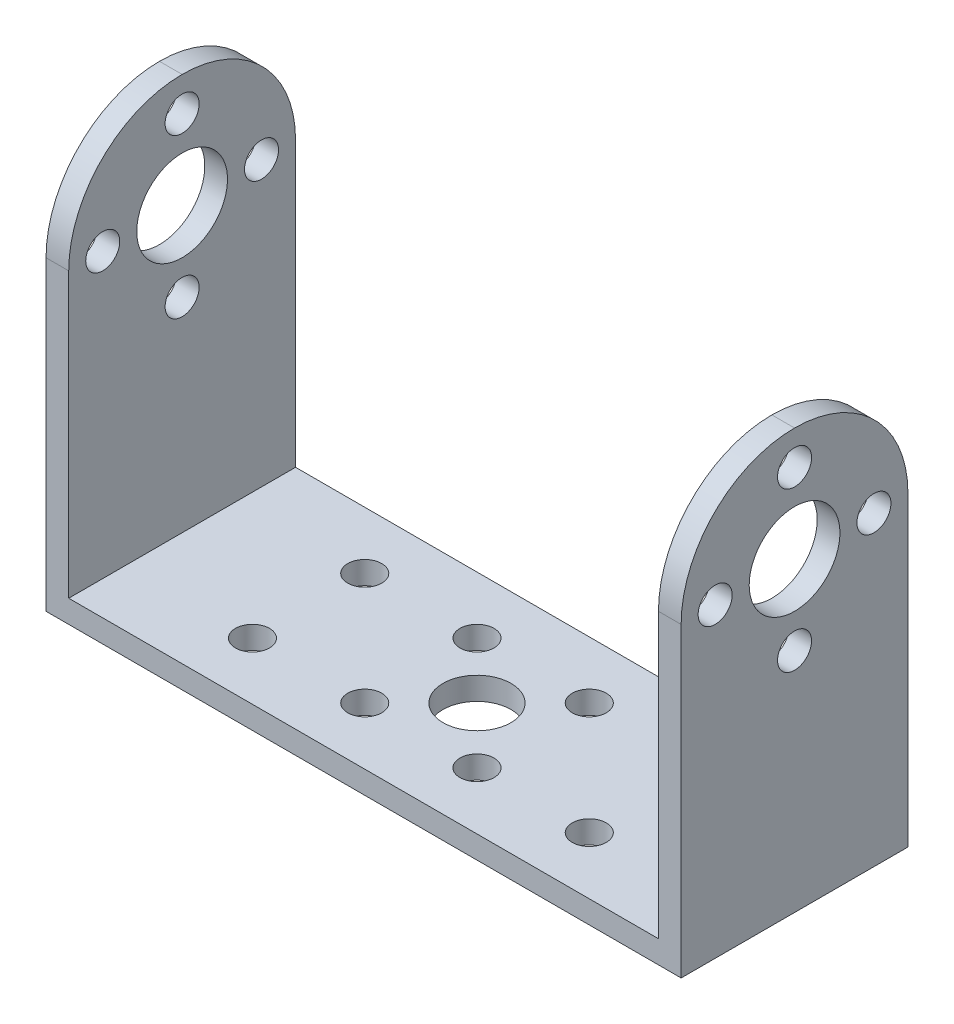
ISO-10303-21;
HEADER;
FILE_DESCRIPTION(('STEP AP214'),'2;1');
FILE_NAME('part.step','',(''),(''),'','','');
FILE_SCHEMA(('AUTOMOTIVE_DESIGN { 1 0 10303 214 1 1 1 1 }'));
ENDSEC;
DATA;
#1=APPLICATION_CONTEXT('core data for automotive mechanical design processes');
#2=APPLICATION_PROTOCOL_DEFINITION('international standard','automotive_design',2000,#1);
#3=PRODUCT_CONTEXT('',#1,'mechanical');
#4=PRODUCT('Part','Part','',(#3));
#5=PRODUCT_RELATED_PRODUCT_CATEGORY('part','',(#4));
#6=PRODUCT_DEFINITION_FORMATION('','',#4);
#7=PRODUCT_DEFINITION_CONTEXT('part definition',#1,'design');
#8=PRODUCT_DEFINITION('design','',#6,#7);
#9=PRODUCT_DEFINITION_SHAPE('','',#8);
#10=(LENGTH_UNIT() NAMED_UNIT(*) SI_UNIT(.MILLI.,.METRE.));
#11=(NAMED_UNIT(*) PLANE_ANGLE_UNIT() SI_UNIT($,.RADIAN.));
#12=(NAMED_UNIT(*) SI_UNIT($,.STERADIAN.) SOLID_ANGLE_UNIT());
#13=UNCERTAINTY_MEASURE_WITH_UNIT(LENGTH_MEASURE(1.E-05),#10,'distance_accuracy_value','');
#14=(GEOMETRIC_REPRESENTATION_CONTEXT(3) GLOBAL_UNCERTAINTY_ASSIGNED_CONTEXT((#13)) GLOBAL_UNIT_ASSIGNED_CONTEXT((#10,
#11,#12)) REPRESENTATION_CONTEXT('',''));
#15=CARTESIAN_POINT('',(0.,0.,0.));
#16=DIRECTION('',(0.,0.,1.));
#17=DIRECTION('',(1.,0.,0.));
#18=AXIS2_PLACEMENT_3D('',#15,#16,#17);
#19=CARTESIAN_POINT('',(2.,0.,20.));
#20=DIRECTION('',(-1.,0.,0.));
#21=DIRECTION('',(0.,0.,1.));
#22=AXIS2_PLACEMENT_3D('',#19,#20,#21);
#23=PLANE('',#22);
#24=CARTESIAN_POINT('',(2.,34.,10.));
#25=DIRECTION('',(-1.,0.,0.));
#26=DIRECTION('',(0.,0.,1.));
#27=AXIS2_PLACEMENT_3D('',#24,#25,#26);
#28=CIRCLE('',#27,1.5);
#29=CARTESIAN_POINT('',(2.,34.,11.5));
#30=VERTEX_POINT('',#29);
#31=EDGE_CURVE('E194',#30,#30,#28,.T.);
#32=ORIENTED_EDGE('',*,*,#31,.T.);
#33=EDGE_LOOP('',(#32));
#34=FACE_BOUND('',#33,.T.);
#35=CARTESIAN_POINT('',(2.,27.0000000000001,17.0000000000001));
#36=DIRECTION('',(-1.,0.,0.));
#37=DIRECTION('',(0.,0.,1.));
#38=AXIS2_PLACEMENT_3D('',#35,#36,#37);
#39=CIRCLE('',#38,1.5);
#40=CARTESIAN_POINT('',(2.,27.0000000000001,18.5000000000001));
#41=VERTEX_POINT('',#40);
#42=EDGE_CURVE('E211',#41,#41,#39,.T.);
#43=ORIENTED_EDGE('',*,*,#42,.T.);
#44=EDGE_LOOP('',(#43));
#45=FACE_BOUND('',#44,.T.);
#46=CARTESIAN_POINT('',(2.,20.,10.0000000000001));
#47=DIRECTION('',(-1.,0.,0.));
#48=DIRECTION('',(0.,0.,1.));
#49=AXIS2_PLACEMENT_3D('',#46,#47,#48);
#50=CIRCLE('',#49,1.5);
#51=CARTESIAN_POINT('',(2.,20.,11.5000000000001));
#52=VERTEX_POINT('',#51);
#53=EDGE_CURVE('E207',#52,#52,#50,.T.);
#54=ORIENTED_EDGE('',*,*,#53,.T.);
#55=EDGE_LOOP('',(#54));
#56=FACE_BOUND('',#55,.T.);
#57=CARTESIAN_POINT('',(2.,27.,3.0000000000001));
#58=DIRECTION('',(-1.,0.,0.));
#59=DIRECTION('',(0.,0.,1.));
#60=AXIS2_PLACEMENT_3D('',#57,#58,#59);
#61=CIRCLE('',#60,1.5);
#62=CARTESIAN_POINT('',(2.,27.,4.5000000000001));
#63=VERTEX_POINT('',#62);
#64=EDGE_CURVE('E203',#63,#63,#61,.T.);
#65=ORIENTED_EDGE('',*,*,#64,.T.);
#66=EDGE_LOOP('',(#65));
#67=FACE_BOUND('',#66,.T.);
#68=CARTESIAN_POINT('',(2.,27.,10.0000000000001));
#69=DIRECTION('',(-1.,0.,0.));
#70=DIRECTION('',(0.,0.,1.));
#71=AXIS2_PLACEMENT_3D('',#68,#69,#70);
#72=CIRCLE('',#71,4.);
#73=CARTESIAN_POINT('',(2.,27.,14.0000000000001));
#74=VERTEX_POINT('',#73);
#75=EDGE_CURVE('E198',#74,#74,#72,.T.);
#76=ORIENTED_EDGE('',*,*,#75,.T.);
#77=EDGE_LOOP('',(#76));
#78=FACE_BOUND('',#77,.T.);
#79=DIRECTION('',(0.,1.,0.));
#80=VECTOR('',#79,1.);
#81=CARTESIAN_POINT('',(2.,0.,0.));
#82=LINE('',#81,#80);
#83=CARTESIAN_POINT('',(2.,2.,0.));
#84=VERTEX_POINT('',#83);
#85=CARTESIAN_POINT('',(2.,27.,0.));
#86=VERTEX_POINT('',#85);
#87=EDGE_CURVE('E151',#84,#86,#82,.T.);
#88=ORIENTED_EDGE('',*,*,#87,.T.);
#89=CARTESIAN_POINT('',(2.,27.,10.));
#90=DIRECTION('',(-1.,0.,0.));
#91=DIRECTION('',(0.,0.,1.));
#92=AXIS2_PLACEMENT_3D('',#89,#90,#91);
#93=CIRCLE('',#92,10.);
#94=CARTESIAN_POINT('',(2.,37.,10.));
#95=VERTEX_POINT('',#94);
#96=EDGE_CURVE('E62',#86,#95,#93,.F.);
#97=ORIENTED_EDGE('',*,*,#96,.T.);
#98=CARTESIAN_POINT('',(2.,27.,10.));
#99=DIRECTION('',(-1.,0.,0.));
#100=DIRECTION('',(0.,0.,1.));
#101=AXIS2_PLACEMENT_3D('',#98,#99,#100);
#102=CIRCLE('',#101,10.);
#103=CARTESIAN_POINT('',(2.,27.,20.));
#104=VERTEX_POINT('',#103);
#105=EDGE_CURVE('E185',#95,#104,#102,.F.);
#106=ORIENTED_EDGE('',*,*,#105,.T.);
#107=DIRECTION('',(0.,1.,0.));
#108=VECTOR('',#107,1.);
#109=CARTESIAN_POINT('',(2.,0.,20.));
#110=LINE('',#109,#108);
#111=CARTESIAN_POINT('',(2.,2.,20.));
#112=VERTEX_POINT('',#111);
#113=EDGE_CURVE('E136',#112,#104,#110,.T.);
#114=ORIENTED_EDGE('',*,*,#113,.F.);
#115=DIRECTION('',(0.,0.,-1.));
#116=VECTOR('',#115,1.);
#117=CARTESIAN_POINT('',(2.,2.,20.));
#118=LINE('',#117,#116);
#119=EDGE_CURVE('E150',#112,#84,#118,.T.);
#120=ORIENTED_EDGE('',*,*,#119,.T.);
#121=EDGE_LOOP('',(#88,#97,#106,#114,#120));
#122=FACE_BOUND('',#121,.T.);
#123=ADVANCED_FACE('F39',(#34,#45,#56,#67,#78,#122),#23,.F.);
#124=CARTESIAN_POINT('',(0.,0.,20.));
#125=DIRECTION('',(-1.,0.,0.));
#126=DIRECTION('',(0.,0.,1.));
#127=AXIS2_PLACEMENT_3D('',#124,#125,#126);
#128=PLANE('',#127);
#129=CARTESIAN_POINT('',(0.,34.,10.));
#130=DIRECTION('',(-1.,0.,0.));
#131=DIRECTION('',(0.,0.,1.));
#132=AXIS2_PLACEMENT_3D('',#129,#130,#131);
#133=CIRCLE('',#132,1.5);
#134=CARTESIAN_POINT('',(0.,34.,11.5));
#135=VERTEX_POINT('',#134);
#136=EDGE_CURVE('E254',#135,#135,#133,.T.);
#137=ORIENTED_EDGE('',*,*,#136,.F.);
#138=EDGE_LOOP('',(#137));
#139=FACE_BOUND('',#138,.T.);
#140=CARTESIAN_POINT('',(0.,27.0000000000001,17.0000000000001));
#141=DIRECTION('',(-1.,0.,0.));
#142=DIRECTION('',(0.,0.,1.));
#143=AXIS2_PLACEMENT_3D('',#140,#141,#142);
#144=CIRCLE('',#143,1.5);
#145=CARTESIAN_POINT('',(0.,27.0000000000001,18.5000000000001));
#146=VERTEX_POINT('',#145);
#147=EDGE_CURVE('E261',#146,#146,#144,.T.);
#148=ORIENTED_EDGE('',*,*,#147,.F.);
#149=EDGE_LOOP('',(#148));
#150=FACE_BOUND('',#149,.T.);
#151=CARTESIAN_POINT('',(0.,20.,10.0000000000001));
#152=DIRECTION('',(-1.,0.,0.));
#153=DIRECTION('',(0.,0.,1.));
#154=AXIS2_PLACEMENT_3D('',#151,#152,#153);
#155=CIRCLE('',#154,1.5);
#156=CARTESIAN_POINT('',(0.,20.,11.5000000000001));
#157=VERTEX_POINT('',#156);
#158=EDGE_CURVE('E267',#157,#157,#155,.T.);
#159=ORIENTED_EDGE('',*,*,#158,.F.);
#160=EDGE_LOOP('',(#159));
#161=FACE_BOUND('',#160,.T.);
#162=CARTESIAN_POINT('',(0.,27.,3.0000000000001));
#163=DIRECTION('',(-1.,0.,0.));
#164=DIRECTION('',(0.,0.,1.));
#165=AXIS2_PLACEMENT_3D('',#162,#163,#164);
#166=CIRCLE('',#165,1.5);
#167=CARTESIAN_POINT('',(0.,27.,4.5000000000001));
#168=VERTEX_POINT('',#167);
#169=EDGE_CURVE('E245',#168,#168,#166,.T.);
#170=ORIENTED_EDGE('',*,*,#169,.F.);
#171=EDGE_LOOP('',(#170));
#172=FACE_BOUND('',#171,.T.);
#173=CARTESIAN_POINT('',(0.,27.,10.0000000000001));
#174=DIRECTION('',(-1.,0.,0.));
#175=DIRECTION('',(0.,0.,1.));
#176=AXIS2_PLACEMENT_3D('',#173,#174,#175);
#177=CIRCLE('',#176,4.);
#178=CARTESIAN_POINT('',(0.,27.,14.0000000000001));
#179=VERTEX_POINT('',#178);
#180=EDGE_CURVE('E257',#179,#179,#177,.T.);
#181=ORIENTED_EDGE('',*,*,#180,.F.);
#182=EDGE_LOOP('',(#181));
#183=FACE_BOUND('',#182,.T.);
#184=CARTESIAN_POINT('',(0.,27.,10.));
#185=DIRECTION('',(-1.,0.,0.));
#186=DIRECTION('',(0.,0.,1.));
#187=AXIS2_PLACEMENT_3D('',#184,#185,#186);
#188=CIRCLE('',#187,10.);
#189=CARTESIAN_POINT('',(0.,27.,20.));
#190=VERTEX_POINT('',#189);
#191=CARTESIAN_POINT('',(0.,37.,10.));
#192=VERTEX_POINT('',#191);
#193=EDGE_CURVE('E48',#190,#192,#188,.T.);
#194=ORIENTED_EDGE('',*,*,#193,.T.);
#195=CARTESIAN_POINT('',(0.,27.,10.));
#196=DIRECTION('',(-1.,0.,0.));
#197=DIRECTION('',(0.,0.,1.));
#198=AXIS2_PLACEMENT_3D('',#195,#196,#197);
#199=CIRCLE('',#198,10.);
#200=CARTESIAN_POINT('',(0.,27.,0.));
#201=VERTEX_POINT('',#200);
#202=EDGE_CURVE('E11',#192,#201,#199,.T.);
#203=ORIENTED_EDGE('',*,*,#202,.T.);
#204=DIRECTION('',(0.,1.,0.));
#205=VECTOR('',#204,1.);
#206=CARTESIAN_POINT('',(0.,0.,0.));
#207=LINE('',#206,#205);
#208=CARTESIAN_POINT('',(0.,0.,0.));
#209=VERTEX_POINT('',#208);
#210=EDGE_CURVE('E120',#209,#201,#207,.T.);
#211=ORIENTED_EDGE('',*,*,#210,.F.);
#212=DIRECTION('',(0.,0.,-1.));
#213=VECTOR('',#212,1.);
#214=CARTESIAN_POINT('',(0.,0.,20.));
#215=LINE('',#214,#213);
#216=CARTESIAN_POINT('',(0.,0.,20.));
#217=VERTEX_POINT('',#216);
#218=EDGE_CURVE('E115',#217,#209,#215,.T.);
#219=ORIENTED_EDGE('',*,*,#218,.F.);
#220=DIRECTION('',(0.,1.,0.));
#221=VECTOR('',#220,1.);
#222=CARTESIAN_POINT('',(0.,0.,20.));
#223=LINE('',#222,#221);
#224=EDGE_CURVE('E118',#217,#190,#223,.T.);
#225=ORIENTED_EDGE('',*,*,#224,.T.);
#226=EDGE_LOOP('',(#194,#203,#211,#219,#225));
#227=FACE_BOUND('',#226,.T.);
#228=ADVANCED_FACE('F117',(#139,#150,#161,#172,#183,#227),#128,.T.);
#229=CARTESIAN_POINT('',(0.,0.,20.));
#230=DIRECTION('',(0.,-1.,0.));
#231=DIRECTION('',(0.,0.,-1.));
#232=AXIS2_PLACEMENT_3D('',#229,#230,#231);
#233=PLANE('',#232);
#234=CARTESIAN_POINT('',(32.9495,0.,14.9495));
#235=DIRECTION('',(0.,-1.,0.));
#236=DIRECTION('',(0.,0.,-1.));
#237=AXIS2_PLACEMENT_3D('',#234,#235,#236);
#238=CIRCLE('',#237,1.5);
#239=CARTESIAN_POINT('',(32.9495,0.,13.4495));
#240=VERTEX_POINT('',#239);
#241=EDGE_CURVE('E440',#240,#240,#238,.T.);
#242=ORIENTED_EDGE('',*,*,#241,.F.);
#243=EDGE_LOOP('',(#242));
#244=FACE_BOUND('',#243,.T.);
#245=CARTESIAN_POINT('',(23.0505,0.,14.9495));
#246=DIRECTION('',(0.,-1.,0.));
#247=DIRECTION('',(0.,0.,-1.));
#248=AXIS2_PLACEMENT_3D('',#245,#246,#247);
#249=CIRCLE('',#248,1.5);
#250=CARTESIAN_POINT('',(23.0505,0.,13.4495));
#251=VERTEX_POINT('',#250);
#252=EDGE_CURVE('E443',#251,#251,#249,.T.);
#253=ORIENTED_EDGE('',*,*,#252,.F.);
#254=EDGE_LOOP('',(#253));
#255=FACE_BOUND('',#254,.T.);
#256=CARTESIAN_POINT('',(23.0505,0.,5.05050000000001));
#257=DIRECTION('',(0.,-1.,0.));
#258=DIRECTION('',(0.,0.,-1.));
#259=AXIS2_PLACEMENT_3D('',#256,#257,#258);
#260=CIRCLE('',#259,1.5);
#261=CARTESIAN_POINT('',(23.0505,0.,3.55050000000001));
#262=VERTEX_POINT('',#261);
#263=EDGE_CURVE('E429',#262,#262,#260,.T.);
#264=ORIENTED_EDGE('',*,*,#263,.F.);
#265=EDGE_LOOP('',(#264));
#266=FACE_BOUND('',#265,.T.);
#267=CARTESIAN_POINT('',(32.9495,0.,5.05050000000001));
#268=DIRECTION('',(0.,-1.,0.));
#269=DIRECTION('',(0.,0.,-1.));
#270=AXIS2_PLACEMENT_3D('',#267,#268,#269);
#271=CIRCLE('',#270,1.5);
#272=CARTESIAN_POINT('',(32.9495,0.,3.55050000000001));
#273=VERTEX_POINT('',#272);
#274=EDGE_CURVE('E425',#273,#273,#271,.T.);
#275=ORIENTED_EDGE('',*,*,#274,.F.);
#276=EDGE_LOOP('',(#275));
#277=FACE_BOUND('',#276,.T.);
#278=CARTESIAN_POINT('',(42.8485,0.,14.9495));
#279=DIRECTION('',(0.,-1.,0.));
#280=DIRECTION('',(0.,0.,-1.));
#281=AXIS2_PLACEMENT_3D('',#278,#279,#280);
#282=CIRCLE('',#281,1.5);
#283=CARTESIAN_POINT('',(42.8485,0.,13.4495));
#284=VERTEX_POINT('',#283);
#285=EDGE_CURVE('E407',#284,#284,#282,.T.);
#286=ORIENTED_EDGE('',*,*,#285,.F.);
#287=EDGE_LOOP('',(#286));
#288=FACE_BOUND('',#287,.T.);
#289=CARTESIAN_POINT('',(42.8485,0.,5.05050000000001));
#290=DIRECTION('',(0.,-1.,0.));
#291=DIRECTION('',(0.,0.,-1.));
#292=AXIS2_PLACEMENT_3D('',#289,#290,#291);
#293=CIRCLE('',#292,1.5);
#294=CARTESIAN_POINT('',(42.8485,0.,3.5505));
#295=VERTEX_POINT('',#294);
#296=EDGE_CURVE('E426',#295,#295,#293,.T.);
#297=ORIENTED_EDGE('',*,*,#296,.F.);
#298=EDGE_LOOP('',(#297));
#299=FACE_BOUND('',#298,.T.);
#300=CARTESIAN_POINT('',(13.1515,0.,5.05050000000001));
#301=DIRECTION('',(0.,-1.,0.));
#302=DIRECTION('',(0.,0.,1.));
#303=AXIS2_PLACEMENT_3D('',#300,#301,#302);
#304=CIRCLE('',#303,1.5);
#305=CARTESIAN_POINT('',(13.1515,0.,6.55050000000001));
#306=VERTEX_POINT('',#305);
#307=EDGE_CURVE('E432',#306,#306,#304,.T.);
#308=ORIENTED_EDGE('',*,*,#307,.F.);
#309=EDGE_LOOP('',(#308));
#310=FACE_BOUND('',#309,.T.);
#311=CARTESIAN_POINT('',(13.1515,0.,14.9495));
#312=DIRECTION('',(0.,-1.,0.));
#313=DIRECTION('',(0.,0.,1.));
#314=AXIS2_PLACEMENT_3D('',#311,#312,#313);
#315=CIRCLE('',#314,1.5);
#316=CARTESIAN_POINT('',(13.1515,0.,16.4495));
#317=VERTEX_POINT('',#316);
#318=EDGE_CURVE('E437',#317,#317,#315,.T.);
#319=ORIENTED_EDGE('',*,*,#318,.F.);
#320=EDGE_LOOP('',(#319));
#321=FACE_BOUND('',#320,.T.);
#322=CARTESIAN_POINT('',(28.,0.,10.));
#323=DIRECTION('',(0.,-1.,0.));
#324=DIRECTION('',(0.,0.,-1.));
#325=AXIS2_PLACEMENT_3D('',#322,#323,#324);
#326=CIRCLE('',#325,3.);
#327=CARTESIAN_POINT('',(28.,0.,7.));
#328=VERTEX_POINT('',#327);
#329=EDGE_CURVE('E219',#328,#328,#326,.T.);
#330=ORIENTED_EDGE('',*,*,#329,.F.);
#331=EDGE_LOOP('',(#330));
#332=FACE_BOUND('',#331,.T.);
#333=DIRECTION('',(-1.,0.,0.));
#334=VECTOR('',#333,1.);
#335=CARTESIAN_POINT('',(0.,0.,0.));
#336=LINE('',#335,#334);
#337=CARTESIAN_POINT('',(56.,0.,0.));
#338=VERTEX_POINT('',#337);
#339=EDGE_CURVE('E155',#338,#209,#336,.T.);
#340=ORIENTED_EDGE('',*,*,#339,.F.);
#341=DIRECTION('',(0.,0.,-1.));
#342=VECTOR('',#341,1.);
#343=CARTESIAN_POINT('',(56.,0.,20.));
#344=LINE('',#343,#342);
#345=CARTESIAN_POINT('',(56.,0.,20.));
#346=VERTEX_POINT('',#345);
#347=EDGE_CURVE('E126',#346,#338,#344,.T.);
#348=ORIENTED_EDGE('',*,*,#347,.F.);
#349=DIRECTION('',(-1.,0.,0.));
#350=VECTOR('',#349,1.);
#351=CARTESIAN_POINT('',(0.,0.,20.));
#352=LINE('',#351,#350);
#353=EDGE_CURVE('E132',#346,#217,#352,.T.);
#354=ORIENTED_EDGE('',*,*,#353,.T.);
#355=ORIENTED_EDGE('',*,*,#218,.T.);
#356=EDGE_LOOP('',(#340,#348,#354,#355));
#357=FACE_BOUND('',#356,.T.);
#358=ADVANCED_FACE('F139',(#244,#255,#266,#277,#288,#299,#310,#321,#332,#357),#233,.T.);
#359=CARTESIAN_POINT('',(56.,0.,20.));
#360=DIRECTION('',(1.,0.,0.));
#361=DIRECTION('',(0.,0.,-1.));
#362=AXIS2_PLACEMENT_3D('',#359,#360,#361);
#363=PLANE('',#362);
#364=CARTESIAN_POINT('',(56.,34.,10.));
#365=DIRECTION('',(-1.,0.,0.));
#366=DIRECTION('',(0.,0.,1.));
#367=AXIS2_PLACEMENT_3D('',#364,#365,#366);
#368=CIRCLE('',#367,1.5);
#369=CARTESIAN_POINT('',(56.,34.,11.5));
#370=VERTEX_POINT('',#369);
#371=EDGE_CURVE('E258',#370,#370,#368,.T.);
#372=ORIENTED_EDGE('',*,*,#371,.T.);
#373=EDGE_LOOP('',(#372));
#374=FACE_BOUND('',#373,.T.);
#375=CARTESIAN_POINT('',(56.,27.0000000000001,17.0000000000001));
#376=DIRECTION('',(-1.,0.,0.));
#377=DIRECTION('',(0.,0.,1.));
#378=AXIS2_PLACEMENT_3D('',#375,#376,#377);
#379=CIRCLE('',#378,1.5);
#380=CARTESIAN_POINT('',(56.,27.0000000000001,18.5000000000001));
#381=VERTEX_POINT('',#380);
#382=EDGE_CURVE('E264',#381,#381,#379,.T.);
#383=ORIENTED_EDGE('',*,*,#382,.T.);
#384=EDGE_LOOP('',(#383));
#385=FACE_BOUND('',#384,.T.);
#386=CARTESIAN_POINT('',(56.,20.,10.0000000000001));
#387=DIRECTION('',(-1.,0.,0.));
#388=DIRECTION('',(0.,0.,1.));
#389=AXIS2_PLACEMENT_3D('',#386,#387,#388);
#390=CIRCLE('',#389,1.5);
#391=CARTESIAN_POINT('',(56.,20.,11.5000000000001));
#392=VERTEX_POINT('',#391);
#393=EDGE_CURVE('E250',#392,#392,#390,.T.);
#394=ORIENTED_EDGE('',*,*,#393,.T.);
#395=EDGE_LOOP('',(#394));
#396=FACE_BOUND('',#395,.T.);
#397=CARTESIAN_POINT('',(56.,27.,3.0000000000001));
#398=DIRECTION('',(-1.,0.,0.));
#399=DIRECTION('',(0.,0.,1.));
#400=AXIS2_PLACEMENT_3D('',#397,#398,#399);
#401=CIRCLE('',#400,1.5);
#402=CARTESIAN_POINT('',(56.,27.,4.5000000000001));
#403=VERTEX_POINT('',#402);
#404=EDGE_CURVE('E241',#403,#403,#401,.T.);
#405=ORIENTED_EDGE('',*,*,#404,.T.);
#406=EDGE_LOOP('',(#405));
#407=FACE_BOUND('',#406,.T.);
#408=CARTESIAN_POINT('',(56.,27.,10.0000000000001));
#409=DIRECTION('',(-1.,0.,0.));
#410=DIRECTION('',(0.,0.,1.));
#411=AXIS2_PLACEMENT_3D('',#408,#409,#410);
#412=CIRCLE('',#411,4.);
#413=CARTESIAN_POINT('',(56.,27.,14.0000000000001));
#414=VERTEX_POINT('',#413);
#415=EDGE_CURVE('E199',#414,#414,#412,.T.);
#416=ORIENTED_EDGE('',*,*,#415,.T.);
#417=EDGE_LOOP('',(#416));
#418=FACE_BOUND('',#417,.T.);
#419=CARTESIAN_POINT('',(56.,27.,10.));
#420=DIRECTION('',(1.,0.,0.));
#421=DIRECTION('',(0.,0.,-1.));
#422=AXIS2_PLACEMENT_3D('',#419,#420,#421);
#423=CIRCLE('',#422,10.);
#424=CARTESIAN_POINT('',(56.,27.,0.));
#425=VERTEX_POINT('',#424);
#426=CARTESIAN_POINT('',(56.,37.,10.));
#427=VERTEX_POINT('',#426);
#428=EDGE_CURVE('E125',#425,#427,#423,.T.);
#429=ORIENTED_EDGE('',*,*,#428,.T.);
#430=CARTESIAN_POINT('',(56.,27.,10.));
#431=DIRECTION('',(1.,0.,0.));
#432=DIRECTION('',(0.,0.,-1.));
#433=AXIS2_PLACEMENT_3D('',#430,#431,#432);
#434=CIRCLE('',#433,10.);
#435=CARTESIAN_POINT('',(56.,27.,20.));
#436=VERTEX_POINT('',#435);
#437=EDGE_CURVE('E170',#427,#436,#434,.T.);
#438=ORIENTED_EDGE('',*,*,#437,.T.);
#439=DIRECTION('',(0.,-1.,0.));
#440=VECTOR('',#439,1.);
#441=CARTESIAN_POINT('',(56.,0.,20.));
#442=LINE('',#441,#440);
#443=EDGE_CURVE('E141',#436,#346,#442,.T.);
#444=ORIENTED_EDGE('',*,*,#443,.T.);
#445=ORIENTED_EDGE('',*,*,#347,.T.);
#446=DIRECTION('',(0.,-1.,0.));
#447=VECTOR('',#446,1.);
#448=CARTESIAN_POINT('',(56.,0.,0.));
#449=LINE('',#448,#447);
#450=EDGE_CURVE('E157',#425,#338,#449,.T.);
#451=ORIENTED_EDGE('',*,*,#450,.F.);
#452=EDGE_LOOP('',(#429,#438,#444,#445,#451));
#453=FACE_BOUND('',#452,.T.);
#454=ADVANCED_FACE('F297',(#374,#385,#396,#407,#418,#453),#363,.T.);
#455=CARTESIAN_POINT('',(54.,0.,20.));
#456=DIRECTION('',(1.,0.,0.));
#457=DIRECTION('',(0.,0.,-1.));
#458=AXIS2_PLACEMENT_3D('',#455,#456,#457);
#459=PLANE('',#458);
#460=CARTESIAN_POINT('',(54.,34.,10.));
#461=DIRECTION('',(1.,0.,0.));
#462=DIRECTION('',(0.,0.,-1.));
#463=AXIS2_PLACEMENT_3D('',#460,#461,#462);
#464=CIRCLE('',#463,1.5);
#465=CARTESIAN_POINT('',(54.,34.,8.5));
#466=VERTEX_POINT('',#465);
#467=EDGE_CURVE('E212',#466,#466,#464,.T.);
#468=ORIENTED_EDGE('',*,*,#467,.T.);
#469=EDGE_LOOP('',(#468));
#470=FACE_BOUND('',#469,.T.);
#471=CARTESIAN_POINT('',(54.,27.0000000000001,17.0000000000001));
#472=DIRECTION('',(1.,0.,0.));
#473=DIRECTION('',(0.,0.,-1.));
#474=AXIS2_PLACEMENT_3D('',#471,#472,#473);
#475=CIRCLE('',#474,1.5);
#476=CARTESIAN_POINT('',(54.,27.0000000000001,15.5000000000001));
#477=VERTEX_POINT('',#476);
#478=EDGE_CURVE('E208',#477,#477,#475,.T.);
#479=ORIENTED_EDGE('',*,*,#478,.T.);
#480=EDGE_LOOP('',(#479));
#481=FACE_BOUND('',#480,.T.);
#482=CARTESIAN_POINT('',(54.,20.,10.0000000000001));
#483=DIRECTION('',(1.,0.,0.));
#484=DIRECTION('',(0.,0.,-1.));
#485=AXIS2_PLACEMENT_3D('',#482,#483,#484);
#486=CIRCLE('',#485,1.5);
#487=CARTESIAN_POINT('',(54.,20.,8.50000000000015));
#488=VERTEX_POINT('',#487);
#489=EDGE_CURVE('E204',#488,#488,#486,.T.);
#490=ORIENTED_EDGE('',*,*,#489,.T.);
#491=EDGE_LOOP('',(#490));
#492=FACE_BOUND('',#491,.T.);
#493=CARTESIAN_POINT('',(54.,27.,3.0000000000001));
#494=DIRECTION('',(1.,0.,0.));
#495=DIRECTION('',(0.,0.,-1.));
#496=AXIS2_PLACEMENT_3D('',#493,#494,#495);
#497=CIRCLE('',#496,1.5);
#498=CARTESIAN_POINT('',(54.,27.,1.5000000000001));
#499=VERTEX_POINT('',#498);
#500=EDGE_CURVE('E200',#499,#499,#497,.T.);
#501=ORIENTED_EDGE('',*,*,#500,.T.);
#502=EDGE_LOOP('',(#501));
#503=FACE_BOUND('',#502,.T.);
#504=CARTESIAN_POINT('',(54.,27.,10.0000000000001));
#505=DIRECTION('',(1.,0.,0.));
#506=DIRECTION('',(0.,0.,-1.));
#507=AXIS2_PLACEMENT_3D('',#504,#505,#506);
#508=CIRCLE('',#507,4.);
#509=CARTESIAN_POINT('',(54.,27.,6.0000000000001));
#510=VERTEX_POINT('',#509);
#511=EDGE_CURVE('E195',#510,#510,#508,.T.);
#512=ORIENTED_EDGE('',*,*,#511,.T.);
#513=EDGE_LOOP('',(#512));
#514=FACE_BOUND('',#513,.T.);
#515=DIRECTION('',(0.,1.,0.));
#516=VECTOR('',#515,1.);
#517=CARTESIAN_POINT('',(54.,0.,20.));
#518=LINE('',#517,#516);
#519=CARTESIAN_POINT('',(54.,27.,20.));
#520=VERTEX_POINT('',#519);
#521=CARTESIAN_POINT('',(54.,2.,20.));
#522=VERTEX_POINT('',#521);
#523=EDGE_CURVE('E143',#520,#522,#518,.F.);
#524=ORIENTED_EDGE('',*,*,#523,.F.);
#525=CARTESIAN_POINT('',(54.,27.,10.));
#526=DIRECTION('',(1.,0.,0.));
#527=DIRECTION('',(0.,0.,-1.));
#528=AXIS2_PLACEMENT_3D('',#525,#526,#527);
#529=CIRCLE('',#528,10.);
#530=CARTESIAN_POINT('',(54.,37.,10.));
#531=VERTEX_POINT('',#530);
#532=EDGE_CURVE('E178',#520,#531,#529,.F.);
#533=ORIENTED_EDGE('',*,*,#532,.T.);
#534=CARTESIAN_POINT('',(54.,27.,10.));
#535=DIRECTION('',(1.,0.,0.));
#536=DIRECTION('',(0.,0.,-1.));
#537=AXIS2_PLACEMENT_3D('',#534,#535,#536);
#538=CIRCLE('',#537,10.);
#539=CARTESIAN_POINT('',(54.,27.,0.));
#540=VERTEX_POINT('',#539);
#541=EDGE_CURVE('E176',#531,#540,#538,.F.);
#542=ORIENTED_EDGE('',*,*,#541,.T.);
#543=DIRECTION('',(0.,1.,0.));
#544=VECTOR('',#543,1.);
#545=CARTESIAN_POINT('',(54.,0.,0.));
#546=LINE('',#545,#544);
#547=CARTESIAN_POINT('',(54.,2.,0.));
#548=VERTEX_POINT('',#547);
#549=EDGE_CURVE('E159',#540,#548,#546,.F.);
#550=ORIENTED_EDGE('',*,*,#549,.T.);
#551=DIRECTION('',(0.,0.,-1.));
#552=VECTOR('',#551,1.);
#553=CARTESIAN_POINT('',(54.,2.,20.));
#554=LINE('',#553,#552);
#555=EDGE_CURVE('E165',#522,#548,#554,.T.);
#556=ORIENTED_EDGE('',*,*,#555,.F.);
#557=EDGE_LOOP('',(#524,#533,#542,#550,#556));
#558=FACE_BOUND('',#557,.T.);
#559=ADVANCED_FACE('F306',(#470,#481,#492,#503,#514,#558),#459,.F.);
#560=CARTESIAN_POINT('',(0.,2.,20.));
#561=DIRECTION('',(0.,-1.,0.));
#562=DIRECTION('',(0.,0.,-1.));
#563=AXIS2_PLACEMENT_3D('',#560,#561,#562);
#564=PLANE('',#563);
#565=CARTESIAN_POINT('',(32.9495,2.,14.9495));
#566=DIRECTION('',(0.,-1.,0.));
#567=DIRECTION('',(0.,0.,-1.));
#568=AXIS2_PLACEMENT_3D('',#565,#566,#567);
#569=CIRCLE('',#568,1.5);
#570=CARTESIAN_POINT('',(32.9495,2.,13.4495));
#571=VERTEX_POINT('',#570);
#572=EDGE_CURVE('E43',#571,#571,#569,.T.);
#573=ORIENTED_EDGE('',*,*,#572,.T.);
#574=EDGE_LOOP('',(#573));
#575=FACE_BOUND('',#574,.T.);
#576=CARTESIAN_POINT('',(23.0505,2.,14.9495));
#577=DIRECTION('',(0.,-1.,0.));
#578=DIRECTION('',(0.,0.,-1.));
#579=AXIS2_PLACEMENT_3D('',#576,#577,#578);
#580=CIRCLE('',#579,1.5);
#581=CARTESIAN_POINT('',(23.0505,2.,13.4495));
#582=VERTEX_POINT('',#581);
#583=EDGE_CURVE('E236',#582,#582,#580,.T.);
#584=ORIENTED_EDGE('',*,*,#583,.T.);
#585=EDGE_LOOP('',(#584));
#586=FACE_BOUND('',#585,.T.);
#587=CARTESIAN_POINT('',(23.0505,2.,5.05050000000001));
#588=DIRECTION('',(0.,-1.,0.));
#589=DIRECTION('',(0.,0.,-1.));
#590=AXIS2_PLACEMENT_3D('',#587,#588,#589);
#591=CIRCLE('',#590,1.5);
#592=CARTESIAN_POINT('',(23.0505,2.,3.55050000000001));
#593=VERTEX_POINT('',#592);
#594=EDGE_CURVE('E234',#593,#593,#591,.T.);
#595=ORIENTED_EDGE('',*,*,#594,.T.);
#596=EDGE_LOOP('',(#595));
#597=FACE_BOUND('',#596,.T.);
#598=CARTESIAN_POINT('',(32.9495,2.,5.05050000000001));
#599=DIRECTION('',(0.,-1.,0.));
#600=DIRECTION('',(0.,0.,-1.));
#601=AXIS2_PLACEMENT_3D('',#598,#599,#600);
#602=CIRCLE('',#601,1.5);
#603=CARTESIAN_POINT('',(32.9495,2.,3.55050000000001));
#604=VERTEX_POINT('',#603);
#605=EDGE_CURVE('E231',#604,#604,#602,.T.);
#606=ORIENTED_EDGE('',*,*,#605,.T.);
#607=EDGE_LOOP('',(#606));
#608=FACE_BOUND('',#607,.T.);
#609=CARTESIAN_POINT('',(42.8485,2.,14.9495));
#610=DIRECTION('',(0.,-1.,0.));
#611=DIRECTION('',(0.,0.,-1.));
#612=AXIS2_PLACEMENT_3D('',#609,#610,#611);
#613=CIRCLE('',#612,1.5);
#614=CARTESIAN_POINT('',(42.8485,2.,13.4495));
#615=VERTEX_POINT('',#614);
#616=EDGE_CURVE('E228',#615,#615,#613,.T.);
#617=ORIENTED_EDGE('',*,*,#616,.T.);
#618=EDGE_LOOP('',(#617));
#619=FACE_BOUND('',#618,.T.);
#620=CARTESIAN_POINT('',(42.8485,2.,5.05050000000001));
#621=DIRECTION('',(0.,-1.,0.));
#622=DIRECTION('',(0.,0.,-1.));
#623=AXIS2_PLACEMENT_3D('',#620,#621,#622);
#624=CIRCLE('',#623,1.5);
#625=CARTESIAN_POINT('',(42.8485,2.,3.5505));
#626=VERTEX_POINT('',#625);
#627=EDGE_CURVE('E225',#626,#626,#624,.T.);
#628=ORIENTED_EDGE('',*,*,#627,.T.);
#629=EDGE_LOOP('',(#628));
#630=FACE_BOUND('',#629,.T.);
#631=CARTESIAN_POINT('',(13.1515,2.,5.05050000000001));
#632=DIRECTION('',(0.,-1.,0.));
#633=DIRECTION('',(0.,0.,-1.));
#634=AXIS2_PLACEMENT_3D('',#631,#632,#633);
#635=CIRCLE('',#634,1.5);
#636=CARTESIAN_POINT('',(13.1515,2.,3.5505));
#637=VERTEX_POINT('',#636);
#638=EDGE_CURVE('E222',#637,#637,#635,.T.);
#639=ORIENTED_EDGE('',*,*,#638,.T.);
#640=EDGE_LOOP('',(#639));
#641=FACE_BOUND('',#640,.T.);
#642=CARTESIAN_POINT('',(13.1515,2.,14.9495));
#643=DIRECTION('',(0.,-1.,0.));
#644=DIRECTION('',(0.,0.,-1.));
#645=AXIS2_PLACEMENT_3D('',#642,#643,#644);
#646=CIRCLE('',#645,1.5);
#647=CARTESIAN_POINT('',(13.1515,2.,13.4495));
#648=VERTEX_POINT('',#647);
#649=EDGE_CURVE('E218',#648,#648,#646,.T.);
#650=ORIENTED_EDGE('',*,*,#649,.T.);
#651=EDGE_LOOP('',(#650));
#652=FACE_BOUND('',#651,.T.);
#653=CARTESIAN_POINT('',(28.,2.,10.));
#654=DIRECTION('',(0.,-1.,0.));
#655=DIRECTION('',(0.,0.,-1.));
#656=AXIS2_PLACEMENT_3D('',#653,#654,#655);
#657=CIRCLE('',#656,3.);
#658=CARTESIAN_POINT('',(28.,2.,7.));
#659=VERTEX_POINT('',#658);
#660=EDGE_CURVE('E215',#659,#659,#657,.T.);
#661=ORIENTED_EDGE('',*,*,#660,.T.);
#662=EDGE_LOOP('',(#661));
#663=FACE_BOUND('',#662,.T.);
#664=DIRECTION('',(1.,0.,0.));
#665=VECTOR('',#664,1.);
#666=CARTESIAN_POINT('',(0.,2.,0.));
#667=LINE('',#666,#665);
#668=EDGE_CURVE('E161',#548,#84,#667,.F.);
#669=ORIENTED_EDGE('',*,*,#668,.T.);
#670=ORIENTED_EDGE('',*,*,#119,.F.);
#671=DIRECTION('',(1.,0.,0.));
#672=VECTOR('',#671,1.);
#673=CARTESIAN_POINT('',(0.,2.,20.));
#674=LINE('',#673,#672);
#675=EDGE_CURVE('E148',#522,#112,#674,.F.);
#676=ORIENTED_EDGE('',*,*,#675,.F.);
#677=ORIENTED_EDGE('',*,*,#555,.T.);
#678=EDGE_LOOP('',(#669,#670,#676,#677));
#679=FACE_BOUND('',#678,.T.);
#680=ADVANCED_FACE('F336',(#575,#586,#597,#608,#619,#630,#641,#652,#663,#679),#564,.F.);
#681=CARTESIAN_POINT('',(0.,0.,20.));
#682=DIRECTION('',(0.,0.,-1.));
#683=DIRECTION('',(-1.,0.,0.));
#684=AXIS2_PLACEMENT_3D('',#681,#682,#683);
#685=PLANE('',#684);
#686=ORIENTED_EDGE('',*,*,#443,.F.);
#687=DIRECTION('',(1.,0.,0.));
#688=VECTOR('',#687,1.);
#689=CARTESIAN_POINT('',(54.,27.,20.));
#690=LINE('',#689,#688);
#691=EDGE_CURVE('E173',#436,#520,#690,.F.);
#692=ORIENTED_EDGE('',*,*,#691,.T.);
#693=ORIENTED_EDGE('',*,*,#523,.T.);
#694=ORIENTED_EDGE('',*,*,#675,.T.);
#695=ORIENTED_EDGE('',*,*,#113,.T.);
#696=DIRECTION('',(1.,0.,0.));
#697=VECTOR('',#696,1.);
#698=CARTESIAN_POINT('',(0.,27.,20.));
#699=LINE('',#698,#697);
#700=EDGE_CURVE('E135',#104,#190,#699,.F.);
#701=ORIENTED_EDGE('',*,*,#700,.T.);
#702=ORIENTED_EDGE('',*,*,#224,.F.);
#703=ORIENTED_EDGE('',*,*,#353,.F.);
#704=EDGE_LOOP('',(#686,#692,#693,#694,#695,#701,#702,#703));
#705=FACE_BOUND('',#704,.T.);
#706=ADVANCED_FACE('F131',(#705),#685,.F.);
#707=CARTESIAN_POINT('',(0.,0.,0.));
#708=DIRECTION('',(0.,0.,-1.));
#709=DIRECTION('',(-1.,0.,0.));
#710=AXIS2_PLACEMENT_3D('',#707,#708,#709);
#711=PLANE('',#710);
#712=ORIENTED_EDGE('',*,*,#549,.F.);
#713=DIRECTION('',(1.,0.,0.));
#714=VECTOR('',#713,1.);
#715=CARTESIAN_POINT('',(0.,27.,0.));
#716=LINE('',#715,#714);
#717=EDGE_CURVE('E183',#540,#425,#716,.T.);
#718=ORIENTED_EDGE('',*,*,#717,.T.);
#719=ORIENTED_EDGE('',*,*,#450,.T.);
#720=ORIENTED_EDGE('',*,*,#339,.T.);
#721=ORIENTED_EDGE('',*,*,#210,.T.);
#722=DIRECTION('',(1.,0.,0.));
#723=VECTOR('',#722,1.);
#724=CARTESIAN_POINT('',(0.,27.,0.));
#725=LINE('',#724,#723);
#726=EDGE_CURVE('E180',#201,#86,#725,.T.);
#727=ORIENTED_EDGE('',*,*,#726,.T.);
#728=ORIENTED_EDGE('',*,*,#87,.F.);
#729=ORIENTED_EDGE('',*,*,#668,.F.);
#730=EDGE_LOOP('',(#712,#718,#719,#720,#721,#727,#728,#729));
#731=FACE_BOUND('',#730,.T.);
#732=ADVANCED_FACE('F291',(#731),#711,.T.);
#733=CARTESIAN_POINT('',(0.,27.,10.));
#734=DIRECTION('',(1.,0.,0.));
#735=DIRECTION('',(0.,0.,-1.));
#736=AXIS2_PLACEMENT_3D('',#733,#734,#735);
#737=CYLINDRICAL_SURFACE('',#736,10.);
#738=ORIENTED_EDGE('',*,*,#717,.F.);
#739=ORIENTED_EDGE('',*,*,#541,.F.);
#740=DIRECTION('',(1.,0.,0.));
#741=VECTOR('',#740,1.);
#742=CARTESIAN_POINT('',(54.,37.,10.));
#743=LINE('',#742,#741);
#744=EDGE_CURVE('E153',#427,#531,#743,.F.);
#745=ORIENTED_EDGE('',*,*,#744,.F.);
#746=ORIENTED_EDGE('',*,*,#428,.F.);
#747=EDGE_LOOP('',(#738,#739,#745,#746));
#748=FACE_BOUND('',#747,.T.);
#749=ADVANCED_FACE('F309',(#748),#737,.T.);
#750=CARTESIAN_POINT('',(54.,27.,10.));
#751=DIRECTION('',(-1.,0.,0.));
#752=DIRECTION('',(0.,0.,1.));
#753=AXIS2_PLACEMENT_3D('',#750,#751,#752);
#754=CYLINDRICAL_SURFACE('',#753,10.);
#755=ORIENTED_EDGE('',*,*,#532,.F.);
#756=ORIENTED_EDGE('',*,*,#691,.F.);
#757=ORIENTED_EDGE('',*,*,#437,.F.);
#758=ORIENTED_EDGE('',*,*,#744,.T.);
#759=EDGE_LOOP('',(#755,#756,#757,#758));
#760=FACE_BOUND('',#759,.T.);
#761=ADVANCED_FACE('F302',(#760),#754,.T.);
#762=CARTESIAN_POINT('',(0.,27.,10.));
#763=DIRECTION('',(-1.,0.,0.));
#764=DIRECTION('',(0.,0.,1.));
#765=AXIS2_PLACEMENT_3D('',#762,#763,#764);
#766=CYLINDRICAL_SURFACE('',#765,10.);
#767=DIRECTION('',(1.,0.,0.));
#768=VECTOR('',#767,1.);
#769=CARTESIAN_POINT('',(2.,37.,10.));
#770=LINE('',#769,#768);
#771=EDGE_CURVE('E191',#192,#95,#770,.T.);
#772=ORIENTED_EDGE('',*,*,#771,.F.);
#773=ORIENTED_EDGE('',*,*,#193,.F.);
#774=ORIENTED_EDGE('',*,*,#700,.F.);
#775=ORIENTED_EDGE('',*,*,#105,.F.);
#776=EDGE_LOOP('',(#772,#773,#774,#775));
#777=FACE_BOUND('',#776,.T.);
#778=ADVANCED_FACE('F41',(#777),#766,.T.);
#779=CARTESIAN_POINT('',(0.,27.,10.));
#780=DIRECTION('',(1.,0.,0.));
#781=DIRECTION('',(0.,0.,-1.));
#782=AXIS2_PLACEMENT_3D('',#779,#780,#781);
#783=CYLINDRICAL_SURFACE('',#782,10.);
#784=ORIENTED_EDGE('',*,*,#202,.F.);
#785=ORIENTED_EDGE('',*,*,#771,.T.);
#786=ORIENTED_EDGE('',*,*,#96,.F.);
#787=ORIENTED_EDGE('',*,*,#726,.F.);
#788=EDGE_LOOP('',(#784,#785,#786,#787));
#789=FACE_BOUND('',#788,.T.);
#790=ADVANCED_FACE('F288',(#789),#783,.T.);
#791=CARTESIAN_POINT('',(56.,27.,10.0000000000001));
#792=DIRECTION('',(-1.,0.,0.));
#793=DIRECTION('',(0.,0.,1.));
#794=AXIS2_PLACEMENT_3D('',#791,#792,#793);
#795=CYLINDRICAL_SURFACE('',#794,4.);
#796=ORIENTED_EDGE('',*,*,#415,.F.);
#797=EDGE_LOOP('',(#796));
#798=FACE_BOUND('',#797,.T.);
#799=ORIENTED_EDGE('',*,*,#511,.F.);
#800=EDGE_LOOP('',(#799));
#801=FACE_BOUND('',#800,.T.);
#802=ADVANCED_FACE('F348',(#798,#801),#795,.F.);
#803=CARTESIAN_POINT('',(56.,27.,3.0000000000001));
#804=DIRECTION('',(-1.,0.,0.));
#805=DIRECTION('',(0.,0.,1.));
#806=AXIS2_PLACEMENT_3D('',#803,#804,#805);
#807=CYLINDRICAL_SURFACE('',#806,1.5);
#808=ORIENTED_EDGE('',*,*,#404,.F.);
#809=EDGE_LOOP('',(#808));
#810=FACE_BOUND('',#809,.T.);
#811=ORIENTED_EDGE('',*,*,#500,.F.);
#812=EDGE_LOOP('',(#811));
#813=FACE_BOUND('',#812,.T.);
#814=ADVANCED_FACE('F363',(#810,#813),#807,.F.);
#815=CARTESIAN_POINT('',(56.,20.,10.0000000000001));
#816=DIRECTION('',(-1.,0.,0.));
#817=DIRECTION('',(0.,0.,1.));
#818=AXIS2_PLACEMENT_3D('',#815,#816,#817);
#819=CYLINDRICAL_SURFACE('',#818,1.5);
#820=ORIENTED_EDGE('',*,*,#393,.F.);
#821=EDGE_LOOP('',(#820));
#822=FACE_BOUND('',#821,.T.);
#823=ORIENTED_EDGE('',*,*,#489,.F.);
#824=EDGE_LOOP('',(#823));
#825=FACE_BOUND('',#824,.T.);
#826=ADVANCED_FACE('F367',(#822,#825),#819,.F.);
#827=CARTESIAN_POINT('',(56.,27.0000000000001,17.0000000000001));
#828=DIRECTION('',(-1.,0.,0.));
#829=DIRECTION('',(0.,0.,1.));
#830=AXIS2_PLACEMENT_3D('',#827,#828,#829);
#831=CYLINDRICAL_SURFACE('',#830,1.5);
#832=ORIENTED_EDGE('',*,*,#382,.F.);
#833=EDGE_LOOP('',(#832));
#834=FACE_BOUND('',#833,.T.);
#835=ORIENTED_EDGE('',*,*,#478,.F.);
#836=EDGE_LOOP('',(#835));
#837=FACE_BOUND('',#836,.T.);
#838=ADVANCED_FACE('F355',(#834,#837),#831,.F.);
#839=CARTESIAN_POINT('',(56.,34.,10.));
#840=DIRECTION('',(-1.,0.,0.));
#841=DIRECTION('',(0.,0.,1.));
#842=AXIS2_PLACEMENT_3D('',#839,#840,#841);
#843=CYLINDRICAL_SURFACE('',#842,1.5);
#844=ORIENTED_EDGE('',*,*,#371,.F.);
#845=EDGE_LOOP('',(#844));
#846=FACE_BOUND('',#845,.T.);
#847=ORIENTED_EDGE('',*,*,#467,.F.);
#848=EDGE_LOOP('',(#847));
#849=FACE_BOUND('',#848,.T.);
#850=ADVANCED_FACE('F346',(#846,#849),#843,.F.);
#851=ORIENTED_EDGE('',*,*,#180,.T.);
#852=EDGE_LOOP('',(#851));
#853=FACE_BOUND('',#852,.T.);
#854=ORIENTED_EDGE('',*,*,#75,.F.);
#855=EDGE_LOOP('',(#854));
#856=FACE_BOUND('',#855,.T.);
#857=ADVANCED_FACE('F342',(#853,#856),#795,.F.);
#858=ORIENTED_EDGE('',*,*,#169,.T.);
#859=EDGE_LOOP('',(#858));
#860=FACE_BOUND('',#859,.T.);
#861=ORIENTED_EDGE('',*,*,#64,.F.);
#862=EDGE_LOOP('',(#861));
#863=FACE_BOUND('',#862,.T.);
#864=ADVANCED_FACE('F345',(#860,#863),#807,.F.);
#865=ORIENTED_EDGE('',*,*,#158,.T.);
#866=EDGE_LOOP('',(#865));
#867=FACE_BOUND('',#866,.T.);
#868=ORIENTED_EDGE('',*,*,#53,.F.);
#869=EDGE_LOOP('',(#868));
#870=FACE_BOUND('',#869,.T.);
#871=ADVANCED_FACE('F353',(#867,#870),#819,.F.);
#872=ORIENTED_EDGE('',*,*,#147,.T.);
#873=EDGE_LOOP('',(#872));
#874=FACE_BOUND('',#873,.T.);
#875=ORIENTED_EDGE('',*,*,#42,.F.);
#876=EDGE_LOOP('',(#875));
#877=FACE_BOUND('',#876,.T.);
#878=ADVANCED_FACE('F349',(#874,#877),#831,.F.);
#879=ORIENTED_EDGE('',*,*,#136,.T.);
#880=EDGE_LOOP('',(#879));
#881=FACE_BOUND('',#880,.T.);
#882=ORIENTED_EDGE('',*,*,#31,.F.);
#883=EDGE_LOOP('',(#882));
#884=FACE_BOUND('',#883,.T.);
#885=ADVANCED_FACE('F352',(#881,#884),#843,.F.);
#886=CARTESIAN_POINT('',(28.,37.,10.));
#887=DIRECTION('',(0.,-1.,0.));
#888=DIRECTION('',(0.,0.,-1.));
#889=AXIS2_PLACEMENT_3D('',#886,#887,#888);
#890=CYLINDRICAL_SURFACE('',#889,3.);
#891=ORIENTED_EDGE('',*,*,#329,.T.);
#892=EDGE_LOOP('',(#891));
#893=FACE_BOUND('',#892,.T.);
#894=ORIENTED_EDGE('',*,*,#660,.F.);
#895=EDGE_LOOP('',(#894));
#896=FACE_BOUND('',#895,.T.);
#897=ADVANCED_FACE('F358',(#893,#896),#890,.F.);
#898=CARTESIAN_POINT('',(13.1515,37.,14.9495));
#899=DIRECTION('',(0.,-1.,0.));
#900=DIRECTION('',(0.,0.,-1.));
#901=AXIS2_PLACEMENT_3D('',#898,#899,#900);
#902=CYLINDRICAL_SURFACE('',#901,1.5);
#903=ORIENTED_EDGE('',*,*,#318,.T.);
#904=EDGE_LOOP('',(#903));
#905=FACE_BOUND('',#904,.T.);
#906=ORIENTED_EDGE('',*,*,#649,.F.);
#907=EDGE_LOOP('',(#906));
#908=FACE_BOUND('',#907,.T.);
#909=ADVANCED_FACE('F370',(#905,#908),#902,.F.);
#910=CARTESIAN_POINT('',(13.1515,37.,5.05050000000001));
#911=DIRECTION('',(0.,-1.,0.));
#912=DIRECTION('',(0.,0.,-1.));
#913=AXIS2_PLACEMENT_3D('',#910,#911,#912);
#914=CYLINDRICAL_SURFACE('',#913,1.5);
#915=ORIENTED_EDGE('',*,*,#307,.T.);
#916=EDGE_LOOP('',(#915));
#917=FACE_BOUND('',#916,.T.);
#918=ORIENTED_EDGE('',*,*,#638,.F.);
#919=EDGE_LOOP('',(#918));
#920=FACE_BOUND('',#919,.T.);
#921=ADVANCED_FACE('F391',(#917,#920),#914,.F.);
#922=CARTESIAN_POINT('',(42.8485,37.,5.05050000000001));
#923=DIRECTION('',(0.,-1.,0.));
#924=DIRECTION('',(0.,0.,-1.));
#925=AXIS2_PLACEMENT_3D('',#922,#923,#924);
#926=CYLINDRICAL_SURFACE('',#925,1.5);
#927=ORIENTED_EDGE('',*,*,#296,.T.);
#928=EDGE_LOOP('',(#927));
#929=FACE_BOUND('',#928,.T.);
#930=ORIENTED_EDGE('',*,*,#627,.F.);
#931=EDGE_LOOP('',(#930));
#932=FACE_BOUND('',#931,.T.);
#933=ADVANCED_FACE('F395',(#929,#932),#926,.F.);
#934=CARTESIAN_POINT('',(42.8485,37.,14.9495));
#935=DIRECTION('',(0.,-1.,0.));
#936=DIRECTION('',(0.,0.,-1.));
#937=AXIS2_PLACEMENT_3D('',#934,#935,#936);
#938=CYLINDRICAL_SURFACE('',#937,1.5);
#939=ORIENTED_EDGE('',*,*,#285,.T.);
#940=EDGE_LOOP('',(#939));
#941=FACE_BOUND('',#940,.T.);
#942=ORIENTED_EDGE('',*,*,#616,.F.);
#943=EDGE_LOOP('',(#942));
#944=FACE_BOUND('',#943,.T.);
#945=ADVANCED_FACE('F376',(#941,#944),#938,.F.);
#946=CARTESIAN_POINT('',(32.9495,37.,5.05050000000001));
#947=DIRECTION('',(0.,-1.,0.));
#948=DIRECTION('',(0.,0.,-1.));
#949=AXIS2_PLACEMENT_3D('',#946,#947,#948);
#950=CYLINDRICAL_SURFACE('',#949,1.5);
#951=ORIENTED_EDGE('',*,*,#274,.T.);
#952=EDGE_LOOP('',(#951));
#953=FACE_BOUND('',#952,.T.);
#954=ORIENTED_EDGE('',*,*,#605,.F.);
#955=EDGE_LOOP('',(#954));
#956=FACE_BOUND('',#955,.T.);
#957=ADVANCED_FACE('F372',(#953,#956),#950,.F.);
#958=CARTESIAN_POINT('',(23.0505,37.,5.05050000000001));
#959=DIRECTION('',(0.,-1.,0.));
#960=DIRECTION('',(0.,0.,-1.));
#961=AXIS2_PLACEMENT_3D('',#958,#959,#960);
#962=CYLINDRICAL_SURFACE('',#961,1.5);
#963=ORIENTED_EDGE('',*,*,#263,.T.);
#964=EDGE_LOOP('',(#963));
#965=FACE_BOUND('',#964,.T.);
#966=ORIENTED_EDGE('',*,*,#594,.F.);
#967=EDGE_LOOP('',(#966));
#968=FACE_BOUND('',#967,.T.);
#969=ADVANCED_FACE('F375',(#965,#968),#962,.F.);
#970=CARTESIAN_POINT('',(23.0505,37.,14.9495));
#971=DIRECTION('',(0.,-1.,0.));
#972=DIRECTION('',(0.,0.,-1.));
#973=AXIS2_PLACEMENT_3D('',#970,#971,#972);
#974=CYLINDRICAL_SURFACE('',#973,1.5);
#975=ORIENTED_EDGE('',*,*,#252,.T.);
#976=EDGE_LOOP('',(#975));
#977=FACE_BOUND('',#976,.T.);
#978=ORIENTED_EDGE('',*,*,#583,.F.);
#979=EDGE_LOOP('',(#978));
#980=FACE_BOUND('',#979,.T.);
#981=ADVANCED_FACE('F380',(#977,#980),#974,.F.);
#982=CARTESIAN_POINT('',(32.9495,37.,14.9495));
#983=DIRECTION('',(0.,-1.,0.));
#984=DIRECTION('',(0.,0.,-1.));
#985=AXIS2_PLACEMENT_3D('',#982,#983,#984);
#986=CYLINDRICAL_SURFACE('',#985,1.5);
#987=ORIENTED_EDGE('',*,*,#241,.T.);
#988=EDGE_LOOP('',(#987));
#989=FACE_BOUND('',#988,.T.);
#990=ORIENTED_EDGE('',*,*,#572,.F.);
#991=EDGE_LOOP('',(#990));
#992=FACE_BOUND('',#991,.T.);
#993=ADVANCED_FACE('F384',(#989,#992),#986,.F.);
#994=CLOSED_SHELL('',(#123,#228,#358,#454,#559,#680,#706,#732,#749,#761,#778,#790,#802,#814,
#826,#838,#850,#857,#864,#871,#878,#885,#897,#909,#921,#933,#945,#957,#969,#981,#993));
#995=MANIFOLD_SOLID_BREP('B2',#994);
#996=ADVANCED_BREP_SHAPE_REPRESENTATION('',(#18,#995),#14);
#997=SHAPE_DEFINITION_REPRESENTATION(#9,#996);
ENDSEC;
END-ISO-10303-21;
